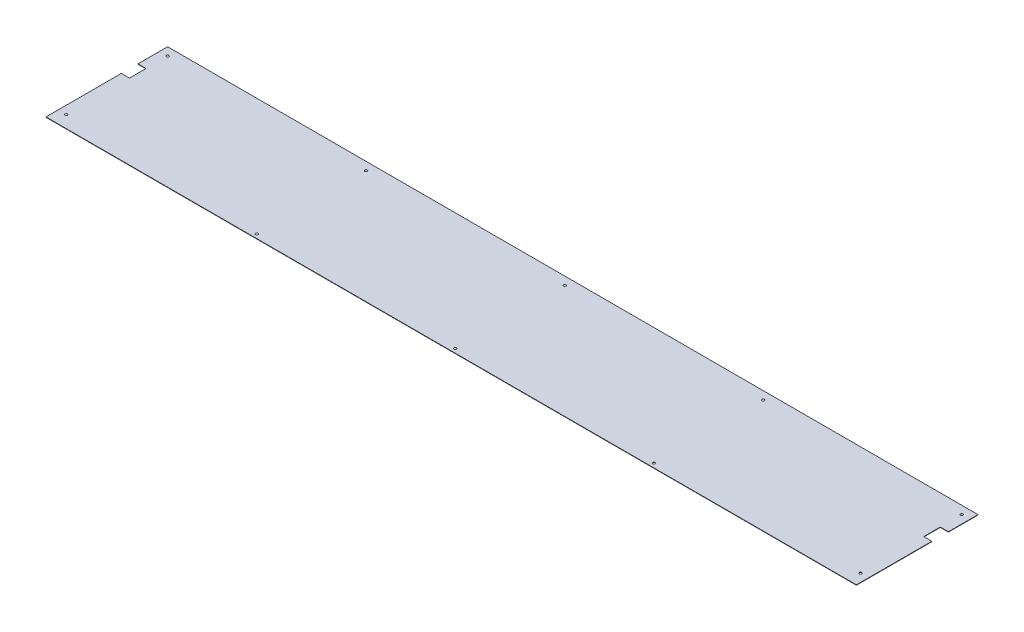
ISO-10303-21;
HEADER;
FILE_DESCRIPTION(('STEP AP214'),'2;1');
FILE_NAME('part.step','',(''),(''),'','','');
FILE_SCHEMA(('AUTOMOTIVE_DESIGN { 1 0 10303 214 1 1 1 1 }'));
ENDSEC;
DATA;
#1=APPLICATION_CONTEXT('core data for automotive mechanical design processes');
#2=APPLICATION_PROTOCOL_DEFINITION('international standard','automotive_design',2000,#1);
#3=PRODUCT_CONTEXT('',#1,'mechanical');
#4=PRODUCT('Part','Part','',(#3));
#5=PRODUCT_RELATED_PRODUCT_CATEGORY('part','',(#4));
#6=PRODUCT_DEFINITION_FORMATION('','',#4);
#7=PRODUCT_DEFINITION_CONTEXT('part definition',#1,'design');
#8=PRODUCT_DEFINITION('design','',#6,#7);
#9=PRODUCT_DEFINITION_SHAPE('','',#8);
#10=(LENGTH_UNIT() NAMED_UNIT(*) SI_UNIT(.MILLI.,.METRE.));
#11=(NAMED_UNIT(*) PLANE_ANGLE_UNIT() SI_UNIT($,.RADIAN.));
#12=(NAMED_UNIT(*) SI_UNIT($,.STERADIAN.) SOLID_ANGLE_UNIT());
#13=UNCERTAINTY_MEASURE_WITH_UNIT(LENGTH_MEASURE(1.E-05),#10,'distance_accuracy_value','');
#14=(GEOMETRIC_REPRESENTATION_CONTEXT(3) GLOBAL_UNCERTAINTY_ASSIGNED_CONTEXT((#13)) GLOBAL_UNIT_ASSIGNED_CONTEXT((#10,
#11,#12)) REPRESENTATION_CONTEXT('',''));
#15=CARTESIAN_POINT('',(0.,0.,0.));
#16=DIRECTION('',(0.,0.,1.));
#17=DIRECTION('',(1.,0.,0.));
#18=AXIS2_PLACEMENT_3D('',#15,#16,#17);
#19=CARTESIAN_POINT('',(-999.999999999999,1.,0.));
#20=DIRECTION('',(-1.,0.,0.));
#21=DIRECTION('',(0.,0.,1.));
#22=AXIS2_PLACEMENT_3D('',#19,#20,#21);
#23=PLANE('',#22);
#24=DIRECTION('',(0.,0.,-1.));
#25=VECTOR('',#24,1.);
#26=CARTESIAN_POINT('',(-999.999999999999,0.,0.));
#27=LINE('',#26,#25);
#28=CARTESIAN_POINT('',(-999.999999999999,0.,-88.4999999999999));
#29=VERTEX_POINT('',#28);
#30=CARTESIAN_POINT('',(-999.999999999999,0.,-161.5));
#31=VERTEX_POINT('',#30);
#32=EDGE_CURVE('E167',#29,#31,#27,.T.);
#33=ORIENTED_EDGE('',*,*,#32,.F.);
#34=DIRECTION('',(0.,-1.,0.));
#35=VECTOR('',#34,1.);
#36=CARTESIAN_POINT('',(-999.999999999999,1.,-88.4999999999999));
#37=LINE('',#36,#35);
#38=CARTESIAN_POINT('',(-999.999999999999,1.,-88.4999999999999));
#39=VERTEX_POINT('',#38);
#40=EDGE_CURVE('E106',#39,#29,#37,.T.);
#41=ORIENTED_EDGE('',*,*,#40,.F.);
#42=DIRECTION('',(0.,0.,-1.));
#43=VECTOR('',#42,1.);
#44=CARTESIAN_POINT('',(-999.999999999999,1.,0.));
#45=LINE('',#44,#43);
#46=CARTESIAN_POINT('',(-999.999999999999,1.,-161.5));
#47=VERTEX_POINT('',#46);
#48=EDGE_CURVE('E387',#39,#47,#45,.T.);
#49=ORIENTED_EDGE('',*,*,#48,.T.);
#50=DIRECTION('',(0.,-1.,0.));
#51=VECTOR('',#50,1.);
#52=CARTESIAN_POINT('',(-999.999999999999,1.,-161.5));
#53=LINE('',#52,#51);
#54=EDGE_CURVE('E59',#47,#31,#53,.T.);
#55=ORIENTED_EDGE('',*,*,#54,.T.);
#56=EDGE_LOOP('',(#33,#41,#49,#55));
#57=FACE_BOUND('',#56,.T.);
#58=ADVANCED_FACE('F41',(#57),#23,.T.);
#59=CARTESIAN_POINT('',(0.,1.,-88.4999999999999));
#60=DIRECTION('',(0.,0.,-1.));
#61=DIRECTION('',(-1.,0.,0.));
#62=AXIS2_PLACEMENT_3D('',#59,#60,#61);
#63=PLANE('',#62);
#64=DIRECTION('',(1.,0.,0.));
#65=VECTOR('',#64,1.);
#66=CARTESIAN_POINT('',(0.,0.,-88.4999999999999));
#67=LINE('',#66,#65);
#68=CARTESIAN_POINT('',(-980.,0.,-88.4999999999999));
#69=VERTEX_POINT('',#68);
#70=EDGE_CURVE('E170',#29,#69,#67,.T.);
#71=ORIENTED_EDGE('',*,*,#70,.T.);
#72=DIRECTION('',(0.,-1.,0.));
#73=VECTOR('',#72,1.);
#74=CARTESIAN_POINT('',(-980.,1.,-88.4999999999999));
#75=LINE('',#74,#73);
#76=CARTESIAN_POINT('',(-980.,1.,-88.4999999999999));
#77=VERTEX_POINT('',#76);
#78=EDGE_CURVE('E237',#77,#69,#75,.T.);
#79=ORIENTED_EDGE('',*,*,#78,.F.);
#80=DIRECTION('',(1.,0.,0.));
#81=VECTOR('',#80,1.);
#82=CARTESIAN_POINT('',(0.,1.,-88.4999999999999));
#83=LINE('',#82,#81);
#84=EDGE_CURVE('E391',#39,#77,#83,.T.);
#85=ORIENTED_EDGE('',*,*,#84,.F.);
#86=ORIENTED_EDGE('',*,*,#40,.T.);
#87=EDGE_LOOP('',(#71,#79,#85,#86));
#88=FACE_BOUND('',#87,.T.);
#89=ADVANCED_FACE('F298',(#88),#63,.F.);
#90=CARTESIAN_POINT('',(-980.,1.,0.));
#91=DIRECTION('',(1.,0.,0.));
#92=DIRECTION('',(0.,0.,-1.));
#93=AXIS2_PLACEMENT_3D('',#90,#91,#92);
#94=PLANE('',#93);
#95=DIRECTION('',(0.,0.,1.));
#96=VECTOR('',#95,1.);
#97=CARTESIAN_POINT('',(-980.,0.,0.));
#98=LINE('',#97,#96);
#99=CARTESIAN_POINT('',(-980.,0.,-47.4999999999999));
#100=VERTEX_POINT('',#99);
#101=EDGE_CURVE('E174',#69,#100,#98,.T.);
#102=ORIENTED_EDGE('',*,*,#101,.T.);
#103=DIRECTION('',(0.,-1.,0.));
#104=VECTOR('',#103,1.);
#105=CARTESIAN_POINT('',(-980.,1.,-47.4999999999999));
#106=LINE('',#105,#104);
#107=CARTESIAN_POINT('',(-980.,1.,-47.4999999999999));
#108=VERTEX_POINT('',#107);
#109=EDGE_CURVE('E234',#108,#100,#106,.T.);
#110=ORIENTED_EDGE('',*,*,#109,.F.);
#111=DIRECTION('',(0.,0.,1.));
#112=VECTOR('',#111,1.);
#113=CARTESIAN_POINT('',(-980.,1.,0.));
#114=LINE('',#113,#112);
#115=EDGE_CURVE('E399',#77,#108,#114,.T.);
#116=ORIENTED_EDGE('',*,*,#115,.F.);
#117=ORIENTED_EDGE('',*,*,#78,.T.);
#118=EDGE_LOOP('',(#102,#110,#116,#117));
#119=FACE_BOUND('',#118,.T.);
#120=ADVANCED_FACE('F303',(#119),#94,.F.);
#121=CARTESIAN_POINT('',(-6.09755301806008E-13,1.,-47.5000000000125));
#122=DIRECTION('',(0.,0.,-1.));
#123=DIRECTION('',(-1.,0.,0.));
#124=AXIS2_PLACEMENT_3D('',#121,#122,#123);
#125=PLANE('',#124);
#126=DIRECTION('',(1.,0.,0.));
#127=VECTOR('',#126,1.);
#128=CARTESIAN_POINT('',(-6.09755301806008E-13,0.,-47.5000000000125));
#129=LINE('',#128,#127);
#130=CARTESIAN_POINT('',(-999.999999999999,0.,-47.4999999999997));
#131=VERTEX_POINT('',#130);
#132=EDGE_CURVE('E178',#131,#100,#129,.T.);
#133=ORIENTED_EDGE('',*,*,#132,.F.);
#134=DIRECTION('',(0.,-1.,0.));
#135=VECTOR('',#134,1.);
#136=CARTESIAN_POINT('',(-999.999999999999,1.,-47.4999999999997));
#137=LINE('',#136,#135);
#138=CARTESIAN_POINT('',(-999.999999999999,1.,-47.4999999999997));
#139=VERTEX_POINT('',#138);
#140=EDGE_CURVE('E231',#139,#131,#137,.T.);
#141=ORIENTED_EDGE('',*,*,#140,.F.);
#142=DIRECTION('',(1.,0.,0.));
#143=VECTOR('',#142,1.);
#144=CARTESIAN_POINT('',(-6.09755301806008E-13,1.,-47.5000000000125));
#145=LINE('',#144,#143);
#146=EDGE_CURVE('E402',#139,#108,#145,.T.);
#147=ORIENTED_EDGE('',*,*,#146,.T.);
#148=ORIENTED_EDGE('',*,*,#109,.T.);
#149=EDGE_LOOP('',(#133,#141,#147,#148));
#150=FACE_BOUND('',#149,.T.);
#151=ADVANCED_FACE('F309',(#150),#125,.T.);
#152=CARTESIAN_POINT('',(-1000.,1.,0.));
#153=DIRECTION('',(1.,0.,0.));
#154=DIRECTION('',(0.,0.,-1.));
#155=AXIS2_PLACEMENT_3D('',#152,#153,#154);
#156=PLANE('',#155);
#157=DIRECTION('',(0.,0.,1.));
#158=VECTOR('',#157,1.);
#159=CARTESIAN_POINT('',(-1000.,0.,0.));
#160=LINE('',#159,#158);
#161=CARTESIAN_POINT('',(-999.999999999999,0.,138.5));
#162=VERTEX_POINT('',#161);
#163=EDGE_CURVE('E182',#131,#162,#160,.T.);
#164=ORIENTED_EDGE('',*,*,#163,.T.);
#165=DIRECTION('',(0.,-1.,0.));
#166=VECTOR('',#165,1.);
#167=CARTESIAN_POINT('',(-999.999999999999,1.,138.5));
#168=LINE('',#167,#166);
#169=CARTESIAN_POINT('',(-999.999999999999,1.,138.5));
#170=VERTEX_POINT('',#169);
#171=EDGE_CURVE('E227',#170,#162,#168,.T.);
#172=ORIENTED_EDGE('',*,*,#171,.F.);
#173=DIRECTION('',(0.,0.,1.));
#174=VECTOR('',#173,1.);
#175=CARTESIAN_POINT('',(-1000.,1.,0.));
#176=LINE('',#175,#174);
#177=EDGE_CURVE('E406',#139,#170,#176,.T.);
#178=ORIENTED_EDGE('',*,*,#177,.F.);
#179=ORIENTED_EDGE('',*,*,#140,.T.);
#180=EDGE_LOOP('',(#164,#172,#178,#179));
#181=FACE_BOUND('',#180,.T.);
#182=ADVANCED_FACE('F313',(#181),#156,.F.);
#183=CARTESIAN_POINT('',(0.,1.,138.5));
#184=DIRECTION('',(0.,0.,-1.));
#185=DIRECTION('',(-1.,0.,0.));
#186=AXIS2_PLACEMENT_3D('',#183,#184,#185);
#187=PLANE('',#186);
#188=DIRECTION('',(1.,0.,0.));
#189=VECTOR('',#188,1.);
#190=CARTESIAN_POINT('',(0.,0.,138.5));
#191=LINE('',#190,#189);
#192=CARTESIAN_POINT('',(1000.,0.,138.5));
#193=VERTEX_POINT('',#192);
#194=EDGE_CURVE('E186',#162,#193,#191,.T.);
#195=ORIENTED_EDGE('',*,*,#194,.T.);
#196=DIRECTION('',(0.,-1.,0.));
#197=VECTOR('',#196,1.);
#198=CARTESIAN_POINT('',(1000.,1.,138.5));
#199=LINE('',#198,#197);
#200=CARTESIAN_POINT('',(1000.,1.,138.5));
#201=VERTEX_POINT('',#200);
#202=EDGE_CURVE('E224',#201,#193,#199,.T.);
#203=ORIENTED_EDGE('',*,*,#202,.F.);
#204=DIRECTION('',(1.,0.,0.));
#205=VECTOR('',#204,1.);
#206=CARTESIAN_POINT('',(0.,1.,138.5));
#207=LINE('',#206,#205);
#208=EDGE_CURVE('E410',#170,#201,#207,.T.);
#209=ORIENTED_EDGE('',*,*,#208,.F.);
#210=ORIENTED_EDGE('',*,*,#171,.T.);
#211=EDGE_LOOP('',(#195,#203,#209,#210));
#212=FACE_BOUND('',#211,.T.);
#213=ADVANCED_FACE('F317',(#212),#187,.F.);
#214=CARTESIAN_POINT('',(1000.,1.,0.));
#215=DIRECTION('',(1.,0.,0.));
#216=DIRECTION('',(0.,0.,-1.));
#217=AXIS2_PLACEMENT_3D('',#214,#215,#216);
#218=PLANE('',#217);
#219=DIRECTION('',(0.,0.,1.));
#220=VECTOR('',#219,1.);
#221=CARTESIAN_POINT('',(1000.,0.,0.));
#222=LINE('',#221,#220);
#223=CARTESIAN_POINT('',(1000.,0.,-47.4999999999997));
#224=VERTEX_POINT('',#223);
#225=EDGE_CURVE('E190',#224,#193,#222,.T.);
#226=ORIENTED_EDGE('',*,*,#225,.F.);
#227=DIRECTION('',(0.,-1.,0.));
#228=VECTOR('',#227,1.);
#229=CARTESIAN_POINT('',(1000.,1.,-47.4999999999997));
#230=LINE('',#229,#228);
#231=CARTESIAN_POINT('',(1000.,1.,-47.4999999999997));
#232=VERTEX_POINT('',#231);
#233=EDGE_CURVE('E221',#232,#224,#230,.T.);
#234=ORIENTED_EDGE('',*,*,#233,.F.);
#235=DIRECTION('',(0.,0.,1.));
#236=VECTOR('',#235,1.);
#237=CARTESIAN_POINT('',(1000.,1.,0.));
#238=LINE('',#237,#236);
#239=EDGE_CURVE('E413',#232,#201,#238,.T.);
#240=ORIENTED_EDGE('',*,*,#239,.T.);
#241=ORIENTED_EDGE('',*,*,#202,.T.);
#242=EDGE_LOOP('',(#226,#234,#240,#241));
#243=FACE_BOUND('',#242,.T.);
#244=ADVANCED_FACE('F321',(#243),#218,.T.);
#245=CARTESIAN_POINT('',(2.02702438168071E-12,1.,-47.5000000000424));
#246=DIRECTION('',(0.,0.,-1.));
#247=DIRECTION('',(-1.,0.,0.));
#248=AXIS2_PLACEMENT_3D('',#245,#246,#247);
#249=PLANE('',#248);
#250=DIRECTION('',(1.,0.,0.));
#251=VECTOR('',#250,1.);
#252=CARTESIAN_POINT('',(2.02702438168071E-12,0.,-47.5000000000424));
#253=LINE('',#252,#251);
#254=CARTESIAN_POINT('',(980.,0.,-47.5000000000005));
#255=VERTEX_POINT('',#254);
#256=EDGE_CURVE('E194',#255,#224,#253,.T.);
#257=ORIENTED_EDGE('',*,*,#256,.F.);
#258=DIRECTION('',(0.,-1.,0.));
#259=VECTOR('',#258,1.);
#260=CARTESIAN_POINT('',(980.,1.,-47.5000000000005));
#261=LINE('',#260,#259);
#262=CARTESIAN_POINT('',(980.,1.,-47.5000000000005));
#263=VERTEX_POINT('',#262);
#264=EDGE_CURVE('E218',#263,#255,#261,.T.);
#265=ORIENTED_EDGE('',*,*,#264,.F.);
#266=DIRECTION('',(1.,0.,0.));
#267=VECTOR('',#266,1.);
#268=CARTESIAN_POINT('',(2.02702438168071E-12,1.,-47.5000000000424));
#269=LINE('',#268,#267);
#270=EDGE_CURVE('E417',#263,#232,#269,.T.);
#271=ORIENTED_EDGE('',*,*,#270,.T.);
#272=ORIENTED_EDGE('',*,*,#233,.T.);
#273=EDGE_LOOP('',(#257,#265,#271,#272));
#274=FACE_BOUND('',#273,.T.);
#275=ADVANCED_FACE('F325',(#274),#249,.T.);
#276=CARTESIAN_POINT('',(980.,1.,0.));
#277=DIRECTION('',(1.,0.,0.));
#278=DIRECTION('',(0.,0.,-1.));
#279=AXIS2_PLACEMENT_3D('',#276,#277,#278);
#280=PLANE('',#279);
#281=DIRECTION('',(0.,0.,1.));
#282=VECTOR('',#281,1.);
#283=CARTESIAN_POINT('',(980.,0.,0.));
#284=LINE('',#283,#282);
#285=CARTESIAN_POINT('',(980.,0.,-88.5000000000006));
#286=VERTEX_POINT('',#285);
#287=EDGE_CURVE('E198',#286,#255,#284,.T.);
#288=ORIENTED_EDGE('',*,*,#287,.F.);
#289=DIRECTION('',(0.,-1.,0.));
#290=VECTOR('',#289,1.);
#291=CARTESIAN_POINT('',(980.,1.,-88.5000000000006));
#292=LINE('',#291,#290);
#293=CARTESIAN_POINT('',(980.,1.,-88.5000000000006));
#294=VERTEX_POINT('',#293);
#295=EDGE_CURVE('E157',#294,#286,#292,.T.);
#296=ORIENTED_EDGE('',*,*,#295,.F.);
#297=DIRECTION('',(0.,0.,1.));
#298=VECTOR('',#297,1.);
#299=CARTESIAN_POINT('',(980.,1.,0.));
#300=LINE('',#299,#298);
#301=EDGE_CURVE('E145',#294,#263,#300,.T.);
#302=ORIENTED_EDGE('',*,*,#301,.T.);
#303=ORIENTED_EDGE('',*,*,#264,.T.);
#304=EDGE_LOOP('',(#288,#296,#302,#303));
#305=FACE_BOUND('',#304,.T.);
#306=ADVANCED_FACE('F329',(#305),#280,.T.);
#307=CARTESIAN_POINT('',(2.7020052861824E-12,1.,-88.5000000000305));
#308=DIRECTION('',(0.,0.,-1.));
#309=DIRECTION('',(-1.,0.,0.));
#310=AXIS2_PLACEMENT_3D('',#307,#308,#309);
#311=PLANE('',#310);
#312=DIRECTION('',(1.,0.,0.));
#313=VECTOR('',#312,1.);
#314=CARTESIAN_POINT('',(2.7020052861824E-12,0.,-88.5000000000305));
#315=LINE('',#314,#313);
#316=CARTESIAN_POINT('',(1000.,0.,-88.4999999999999));
#317=VERTEX_POINT('',#316);
#318=EDGE_CURVE('E153',#286,#317,#315,.T.);
#319=ORIENTED_EDGE('',*,*,#318,.T.);
#320=DIRECTION('',(0.,-1.,0.));
#321=VECTOR('',#320,1.);
#322=CARTESIAN_POINT('',(1000.,1.,-88.4999999999999));
#323=LINE('',#322,#321);
#324=CARTESIAN_POINT('',(1000.,1.,-88.4999999999999));
#325=VERTEX_POINT('',#324);
#326=EDGE_CURVE('E150',#325,#317,#323,.T.);
#327=ORIENTED_EDGE('',*,*,#326,.F.);
#328=DIRECTION('',(1.,0.,0.));
#329=VECTOR('',#328,1.);
#330=CARTESIAN_POINT('',(2.7020052861824E-12,1.,-88.5000000000305));
#331=LINE('',#330,#329);
#332=EDGE_CURVE('E136',#294,#325,#331,.T.);
#333=ORIENTED_EDGE('',*,*,#332,.F.);
#334=ORIENTED_EDGE('',*,*,#295,.T.);
#335=EDGE_LOOP('',(#319,#327,#333,#334));
#336=FACE_BOUND('',#335,.T.);
#337=ADVANCED_FACE('F151',(#336),#311,.F.);
#338=CARTESIAN_POINT('',(1000.,1.,0.));
#339=DIRECTION('',(1.,0.,0.));
#340=DIRECTION('',(0.,0.,-1.));
#341=AXIS2_PLACEMENT_3D('',#338,#339,#340);
#342=PLANE('',#341);
#343=DIRECTION('',(0.,0.,1.));
#344=VECTOR('',#343,1.);
#345=CARTESIAN_POINT('',(1000.,0.,0.));
#346=LINE('',#345,#344);
#347=CARTESIAN_POINT('',(1000.,0.,-161.5));
#348=VERTEX_POINT('',#347);
#349=EDGE_CURVE('E204',#348,#317,#346,.T.);
#350=ORIENTED_EDGE('',*,*,#349,.F.);
#351=DIRECTION('',(0.,-1.,0.));
#352=VECTOR('',#351,1.);
#353=CARTESIAN_POINT('',(1000.,1.,-161.5));
#354=LINE('',#353,#352);
#355=CARTESIAN_POINT('',(1000.,1.,-161.5));
#356=VERTEX_POINT('',#355);
#357=EDGE_CURVE('E97',#356,#348,#354,.T.);
#358=ORIENTED_EDGE('',*,*,#357,.F.);
#359=DIRECTION('',(0.,0.,1.));
#360=VECTOR('',#359,1.);
#361=CARTESIAN_POINT('',(1000.,1.,0.));
#362=LINE('',#361,#360);
#363=EDGE_CURVE('E142',#356,#325,#362,.T.);
#364=ORIENTED_EDGE('',*,*,#363,.T.);
#365=ORIENTED_EDGE('',*,*,#326,.T.);
#366=EDGE_LOOP('',(#350,#358,#364,#365));
#367=FACE_BOUND('',#366,.T.);
#368=ADVANCED_FACE('F159',(#367),#342,.T.);
#369=CARTESIAN_POINT('',(0.,1.,-161.5));
#370=DIRECTION('',(0.,0.,-1.));
#371=DIRECTION('',(-1.,0.,0.));
#372=AXIS2_PLACEMENT_3D('',#369,#370,#371);
#373=PLANE('',#372);
#374=DIRECTION('',(1.,0.,0.));
#375=VECTOR('',#374,1.);
#376=CARTESIAN_POINT('',(0.,0.,-161.5));
#377=LINE('',#376,#375);
#378=EDGE_CURVE('E207',#31,#348,#377,.T.);
#379=ORIENTED_EDGE('',*,*,#378,.F.);
#380=ORIENTED_EDGE('',*,*,#54,.F.);
#381=DIRECTION('',(1.,0.,0.));
#382=VECTOR('',#381,1.);
#383=CARTESIAN_POINT('',(0.,1.,-161.5));
#384=LINE('',#383,#382);
#385=EDGE_CURVE('E161',#47,#356,#384,.T.);
#386=ORIENTED_EDGE('',*,*,#385,.T.);
#387=ORIENTED_EDGE('',*,*,#357,.T.);
#388=EDGE_LOOP('',(#379,#380,#386,#387));
#389=FACE_BOUND('',#388,.T.);
#390=ADVANCED_FACE('F338',(#389),#373,.T.);
#391=CARTESIAN_POINT('',(0.,1.,0.));
#392=DIRECTION('',(0.,1.,0.));
#393=DIRECTION('',(0.,0.,1.));
#394=AXIS2_PLACEMENT_3D('',#391,#392,#393);
#395=PLANE('',#394);
#396=CARTESIAN_POINT('',(-979.999999999999,1.,108.5));
#397=DIRECTION('',(0.,1.,0.));
#398=DIRECTION('',(0.,0.,1.));
#399=AXIS2_PLACEMENT_3D('',#396,#397,#398);
#400=CIRCLE('',#399,3.00000000000005);
#401=CARTESIAN_POINT('',(-979.999999999999,1.,111.5));
#402=VERTEX_POINT('',#401);
#403=EDGE_CURVE('E211',#402,#402,#400,.T.);
#404=ORIENTED_EDGE('',*,*,#403,.F.);
#405=EDGE_LOOP('',(#404));
#406=FACE_BOUND('',#405,.T.);
#407=CARTESIAN_POINT('',(-489.999999999999,1.,128.5));
#408=DIRECTION('',(0.,1.,0.));
#409=DIRECTION('',(0.,0.,1.));
#410=AXIS2_PLACEMENT_3D('',#407,#408,#409);
#411=CIRCLE('',#410,2.99999999999999);
#412=CARTESIAN_POINT('',(-489.999999999999,1.,131.5));
#413=VERTEX_POINT('',#412);
#414=EDGE_CURVE('E354',#413,#413,#411,.T.);
#415=ORIENTED_EDGE('',*,*,#414,.F.);
#416=EDGE_LOOP('',(#415));
#417=FACE_BOUND('',#416,.T.);
#418=CARTESIAN_POINT('',(5.48833650015357E-13,1.,128.5));
#419=DIRECTION('',(0.,1.,0.));
#420=DIRECTION('',(0.,0.,1.));
#421=AXIS2_PLACEMENT_3D('',#418,#419,#420);
#422=CIRCLE('',#421,3.);
#423=CARTESIAN_POINT('',(5.48833650015357E-13,1.,131.5));
#424=VERTEX_POINT('',#423);
#425=EDGE_CURVE('E358',#424,#424,#422,.T.);
#426=ORIENTED_EDGE('',*,*,#425,.F.);
#427=EDGE_LOOP('',(#426));
#428=FACE_BOUND('',#427,.T.);
#429=CARTESIAN_POINT('',(980.000000000001,1.,108.5));
#430=DIRECTION('',(0.,1.,0.));
#431=DIRECTION('',(0.,0.,1.));
#432=AXIS2_PLACEMENT_3D('',#429,#430,#431);
#433=CIRCLE('',#432,3.00000000000005);
#434=CARTESIAN_POINT('',(980.000000000001,1.,111.5));
#435=VERTEX_POINT('',#434);
#436=EDGE_CURVE('E362',#435,#435,#433,.T.);
#437=ORIENTED_EDGE('',*,*,#436,.F.);
#438=EDGE_LOOP('',(#437));
#439=FACE_BOUND('',#438,.T.);
#440=CARTESIAN_POINT('',(490.000000000001,1.,128.5));
#441=DIRECTION('',(0.,1.,0.));
#442=DIRECTION('',(0.,0.,1.));
#443=AXIS2_PLACEMENT_3D('',#440,#441,#442);
#444=CIRCLE('',#443,2.99999999999999);
#445=CARTESIAN_POINT('',(490.000000000001,1.,131.5));
#446=VERTEX_POINT('',#445);
#447=EDGE_CURVE('E365',#446,#446,#444,.T.);
#448=ORIENTED_EDGE('',*,*,#447,.F.);
#449=EDGE_LOOP('',(#448));
#450=FACE_BOUND('',#449,.T.);
#451=CARTESIAN_POINT('',(-489.999999999999,1.,-141.5));
#452=DIRECTION('',(0.,1.,0.));
#453=DIRECTION('',(0.,0.,1.));
#454=AXIS2_PLACEMENT_3D('',#451,#452,#453);
#455=CIRCLE('',#454,2.99999999999999);
#456=CARTESIAN_POINT('',(-489.999999999999,1.,-138.5));
#457=VERTEX_POINT('',#456);
#458=EDGE_CURVE('E369',#457,#457,#455,.T.);
#459=ORIENTED_EDGE('',*,*,#458,.F.);
#460=EDGE_LOOP('',(#459));
#461=FACE_BOUND('',#460,.T.);
#462=CARTESIAN_POINT('',(490.000000000001,1.,-141.5));
#463=DIRECTION('',(0.,1.,0.));
#464=DIRECTION('',(0.,0.,1.));
#465=AXIS2_PLACEMENT_3D('',#462,#463,#464);
#466=CIRCLE('',#465,2.99999999999999);
#467=CARTESIAN_POINT('',(490.000000000001,1.,-138.5));
#468=VERTEX_POINT('',#467);
#469=EDGE_CURVE('E373',#468,#468,#466,.T.);
#470=ORIENTED_EDGE('',*,*,#469,.F.);
#471=EDGE_LOOP('',(#470));
#472=FACE_BOUND('',#471,.T.);
#473=CARTESIAN_POINT('',(5.55111512312578E-13,1.,-141.5));
#474=DIRECTION('',(0.,1.,0.));
#475=DIRECTION('',(0.,0.,1.));
#476=AXIS2_PLACEMENT_3D('',#473,#474,#475);
#477=CIRCLE('',#476,3.);
#478=CARTESIAN_POINT('',(5.55111512312578E-13,1.,-138.5));
#479=VERTEX_POINT('',#478);
#480=EDGE_CURVE('E377',#479,#479,#477,.T.);
#481=ORIENTED_EDGE('',*,*,#480,.F.);
#482=EDGE_LOOP('',(#481));
#483=FACE_BOUND('',#482,.T.);
#484=CARTESIAN_POINT('',(980.000000000001,1.,-141.5));
#485=DIRECTION('',(0.,1.,0.));
#486=DIRECTION('',(0.,0.,1.));
#487=AXIS2_PLACEMENT_3D('',#484,#485,#486);
#488=CIRCLE('',#487,3.00000000000005);
#489=CARTESIAN_POINT('',(980.000000000001,1.,-138.5));
#490=VERTEX_POINT('',#489);
#491=EDGE_CURVE('E381',#490,#490,#488,.T.);
#492=ORIENTED_EDGE('',*,*,#491,.F.);
#493=EDGE_LOOP('',(#492));
#494=FACE_BOUND('',#493,.T.);
#495=CARTESIAN_POINT('',(-979.999999999999,1.,-141.5));
#496=DIRECTION('',(0.,1.,0.));
#497=DIRECTION('',(0.,0.,1.));
#498=AXIS2_PLACEMENT_3D('',#495,#496,#497);
#499=CIRCLE('',#498,3.00000000000005);
#500=CARTESIAN_POINT('',(-979.999999999999,1.,-138.5));
#501=VERTEX_POINT('',#500);
#502=EDGE_CURVE('E384',#501,#501,#499,.T.);
#503=ORIENTED_EDGE('',*,*,#502,.F.);
#504=EDGE_LOOP('',(#503));
#505=FACE_BOUND('',#504,.T.);
#506=ORIENTED_EDGE('',*,*,#48,.F.);
#507=ORIENTED_EDGE('',*,*,#84,.T.);
#508=ORIENTED_EDGE('',*,*,#115,.T.);
#509=ORIENTED_EDGE('',*,*,#146,.F.);
#510=ORIENTED_EDGE('',*,*,#177,.T.);
#511=ORIENTED_EDGE('',*,*,#208,.T.);
#512=ORIENTED_EDGE('',*,*,#239,.F.);
#513=ORIENTED_EDGE('',*,*,#270,.F.);
#514=ORIENTED_EDGE('',*,*,#301,.F.);
#515=ORIENTED_EDGE('',*,*,#332,.T.);
#516=ORIENTED_EDGE('',*,*,#363,.F.);
#517=ORIENTED_EDGE('',*,*,#385,.F.);
#518=EDGE_LOOP('',(#506,#507,#508,#509,#510,#511,#512,#513,#514,#515,#516,#517));
#519=FACE_BOUND('',#518,.T.);
#520=ADVANCED_FACE('F139',(#406,#417,#428,#439,#450,#461,#472,#483,#494,#505,#519),#395,.T.);
#521=CARTESIAN_POINT('',(0.,0.,0.));
#522=DIRECTION('',(0.,1.,0.));
#523=DIRECTION('',(0.,0.,1.));
#524=AXIS2_PLACEMENT_3D('',#521,#522,#523);
#525=PLANE('',#524);
#526=CARTESIAN_POINT('',(980.000000000001,0.,108.5));
#527=DIRECTION('',(0.,1.,0.));
#528=DIRECTION('',(0.,0.,1.));
#529=AXIS2_PLACEMENT_3D('',#526,#527,#528);
#530=CIRCLE('',#529,4.00000000000023);
#531=CARTESIAN_POINT('',(980.000000000001,0.,112.5));
#532=VERTEX_POINT('',#531);
#533=EDGE_CURVE('E11',#532,#532,#530,.T.);
#534=ORIENTED_EDGE('',*,*,#533,.T.);
#535=EDGE_LOOP('',(#534));
#536=FACE_BOUND('',#535,.T.);
#537=CARTESIAN_POINT('',(490.000000000001,0.,128.5));
#538=DIRECTION('',(0.,1.,0.));
#539=DIRECTION('',(0.,0.,1.));
#540=AXIS2_PLACEMENT_3D('',#537,#538,#539);
#541=CIRCLE('',#540,3.99999999999998);
#542=CARTESIAN_POINT('',(490.000000000001,0.,132.5));
#543=VERTEX_POINT('',#542);
#544=EDGE_CURVE('E51',#543,#543,#541,.T.);
#545=ORIENTED_EDGE('',*,*,#544,.T.);
#546=EDGE_LOOP('',(#545));
#547=FACE_BOUND('',#546,.T.);
#548=CARTESIAN_POINT('',(5.48833650015357E-13,0.,128.5));
#549=DIRECTION('',(0.,1.,0.));
#550=DIRECTION('',(0.,0.,1.));
#551=AXIS2_PLACEMENT_3D('',#548,#549,#550);
#552=CIRCLE('',#551,3.99999999999956);
#553=CARTESIAN_POINT('',(5.48833650015357E-13,0.,132.5));
#554=VERTEX_POINT('',#553);
#555=EDGE_CURVE('E271',#554,#554,#552,.T.);
#556=ORIENTED_EDGE('',*,*,#555,.T.);
#557=EDGE_LOOP('',(#556));
#558=FACE_BOUND('',#557,.T.);
#559=CARTESIAN_POINT('',(-489.999999999999,0.,128.5));
#560=DIRECTION('',(0.,1.,0.));
#561=DIRECTION('',(0.,0.,1.));
#562=AXIS2_PLACEMENT_3D('',#559,#560,#561);
#563=CIRCLE('',#562,3.99999999999998);
#564=CARTESIAN_POINT('',(-489.999999999999,0.,132.5));
#565=VERTEX_POINT('',#564);
#566=EDGE_CURVE('E267',#565,#565,#563,.T.);
#567=ORIENTED_EDGE('',*,*,#566,.T.);
#568=EDGE_LOOP('',(#567));
#569=FACE_BOUND('',#568,.T.);
#570=CARTESIAN_POINT('',(-979.999999999999,0.,108.5));
#571=DIRECTION('',(0.,1.,0.));
#572=DIRECTION('',(0.,0.,1.));
#573=AXIS2_PLACEMENT_3D('',#570,#571,#572);
#574=CIRCLE('',#573,4.00000000000023);
#575=CARTESIAN_POINT('',(-979.999999999999,0.,112.5));
#576=VERTEX_POINT('',#575);
#577=EDGE_CURVE('E263',#576,#576,#574,.T.);
#578=ORIENTED_EDGE('',*,*,#577,.T.);
#579=EDGE_LOOP('',(#578));
#580=FACE_BOUND('',#579,.T.);
#581=CARTESIAN_POINT('',(-979.999999999999,0.,-141.5));
#582=DIRECTION('',(0.,1.,0.));
#583=DIRECTION('',(0.,0.,1.));
#584=AXIS2_PLACEMENT_3D('',#581,#582,#583);
#585=CIRCLE('',#584,4.00000000000023);
#586=CARTESIAN_POINT('',(-979.999999999999,0.,-137.5));
#587=VERTEX_POINT('',#586);
#588=EDGE_CURVE('E259',#587,#587,#585,.T.);
#589=ORIENTED_EDGE('',*,*,#588,.T.);
#590=EDGE_LOOP('',(#589));
#591=FACE_BOUND('',#590,.T.);
#592=CARTESIAN_POINT('',(-489.999999999999,0.,-141.5));
#593=DIRECTION('',(0.,1.,0.));
#594=DIRECTION('',(0.,0.,1.));
#595=AXIS2_PLACEMENT_3D('',#592,#593,#594);
#596=CIRCLE('',#595,4.00000000000067);
#597=CARTESIAN_POINT('',(-489.999999999999,0.,-137.499999999999));
#598=VERTEX_POINT('',#597);
#599=EDGE_CURVE('E255',#598,#598,#596,.T.);
#600=ORIENTED_EDGE('',*,*,#599,.T.);
#601=EDGE_LOOP('',(#600));
#602=FACE_BOUND('',#601,.T.);
#603=CARTESIAN_POINT('',(5.55111512312578E-13,0.,-141.5));
#604=DIRECTION('',(0.,1.,0.));
#605=DIRECTION('',(0.,0.,1.));
#606=AXIS2_PLACEMENT_3D('',#603,#604,#605);
#607=CIRCLE('',#606,3.99999999999956);
#608=CARTESIAN_POINT('',(5.55111512312578E-13,0.,-137.5));
#609=VERTEX_POINT('',#608);
#610=EDGE_CURVE('E251',#609,#609,#607,.T.);
#611=ORIENTED_EDGE('',*,*,#610,.T.);
#612=EDGE_LOOP('',(#611));
#613=FACE_BOUND('',#612,.T.);
#614=CARTESIAN_POINT('',(490.000000000001,0.,-141.5));
#615=DIRECTION('',(0.,1.,0.));
#616=DIRECTION('',(0.,0.,1.));
#617=AXIS2_PLACEMENT_3D('',#614,#615,#616);
#618=CIRCLE('',#617,4.00000000000067);
#619=CARTESIAN_POINT('',(490.000000000001,0.,-137.499999999999));
#620=VERTEX_POINT('',#619);
#621=EDGE_CURVE('E247',#620,#620,#618,.T.);
#622=ORIENTED_EDGE('',*,*,#621,.T.);
#623=EDGE_LOOP('',(#622));
#624=FACE_BOUND('',#623,.T.);
#625=CARTESIAN_POINT('',(980.000000000001,0.,-141.5));
#626=DIRECTION('',(0.,1.,0.));
#627=DIRECTION('',(0.,0.,1.));
#628=AXIS2_PLACEMENT_3D('',#625,#626,#627);
#629=CIRCLE('',#628,4.00000000000023);
#630=CARTESIAN_POINT('',(980.000000000001,0.,-137.5));
#631=VERTEX_POINT('',#630);
#632=EDGE_CURVE('E243',#631,#631,#629,.T.);
#633=ORIENTED_EDGE('',*,*,#632,.T.);
#634=EDGE_LOOP('',(#633));
#635=FACE_BOUND('',#634,.T.);
#636=ORIENTED_EDGE('',*,*,#32,.T.);
#637=ORIENTED_EDGE('',*,*,#378,.T.);
#638=ORIENTED_EDGE('',*,*,#349,.T.);
#639=ORIENTED_EDGE('',*,*,#318,.F.);
#640=ORIENTED_EDGE('',*,*,#287,.T.);
#641=ORIENTED_EDGE('',*,*,#256,.T.);
#642=ORIENTED_EDGE('',*,*,#225,.T.);
#643=ORIENTED_EDGE('',*,*,#194,.F.);
#644=ORIENTED_EDGE('',*,*,#163,.F.);
#645=ORIENTED_EDGE('',*,*,#132,.T.);
#646=ORIENTED_EDGE('',*,*,#101,.F.);
#647=ORIENTED_EDGE('',*,*,#70,.F.);
#648=EDGE_LOOP('',(#636,#637,#638,#639,#640,#641,#642,#643,#644,#645,#646,#647));
#649=FACE_BOUND('',#648,.T.);
#650=ADVANCED_FACE('F278',(#536,#547,#558,#569,#580,#591,#602,#613,#624,#635,#649),#525,.F.);
#651=CARTESIAN_POINT('',(980.000000000001,0.,108.5));
#652=DIRECTION('',(0.,-1.,0.));
#653=DIRECTION('',(0.,0.,-1.));
#654=AXIS2_PLACEMENT_3D('',#651,#652,#653);
#655=CONICAL_SURFACE('',#654,4.00000000000023,0.785398163397554);
#656=ORIENTED_EDGE('',*,*,#436,.T.);
#657=EDGE_LOOP('',(#656));
#658=FACE_BOUND('',#657,.T.);
#659=ORIENTED_EDGE('',*,*,#533,.F.);
#660=EDGE_LOOP('',(#659));
#661=FACE_BOUND('',#660,.T.);
#662=ADVANCED_FACE('F284',(#658,#661),#655,.F.);
#663=CARTESIAN_POINT('',(490.000000000001,0.,128.5));
#664=DIRECTION('',(0.,-1.,0.));
#665=DIRECTION('',(0.,0.,-1.));
#666=AXIS2_PLACEMENT_3D('',#663,#664,#665);
#667=CONICAL_SURFACE('',#666,3.99999999999999,0.785398163397547);
#668=ORIENTED_EDGE('',*,*,#447,.T.);
#669=EDGE_LOOP('',(#668));
#670=FACE_BOUND('',#669,.T.);
#671=ORIENTED_EDGE('',*,*,#544,.F.);
#672=EDGE_LOOP('',(#671));
#673=FACE_BOUND('',#672,.T.);
#674=ADVANCED_FACE('F281',(#670,#673),#667,.F.);
#675=CARTESIAN_POINT('',(5.48833650015357E-13,0.,128.5));
#676=DIRECTION('',(0.,-1.,0.));
#677=DIRECTION('',(0.,0.,-1.));
#678=AXIS2_PLACEMENT_3D('',#675,#676,#677);
#679=CONICAL_SURFACE('',#678,3.99999999999956,0.785398163397554);
#680=ORIENTED_EDGE('',*,*,#425,.T.);
#681=EDGE_LOOP('',(#680));
#682=FACE_BOUND('',#681,.T.);
#683=ORIENTED_EDGE('',*,*,#555,.F.);
#684=EDGE_LOOP('',(#683));
#685=FACE_BOUND('',#684,.T.);
#686=ADVANCED_FACE('F283',(#682,#685),#679,.F.);
#687=CARTESIAN_POINT('',(-489.999999999999,0.,128.5));
#688=DIRECTION('',(0.,-1.,0.));
#689=DIRECTION('',(0.,0.,-1.));
#690=AXIS2_PLACEMENT_3D('',#687,#688,#689);
#691=CONICAL_SURFACE('',#690,3.99999999999999,0.785398163397547);
#692=ORIENTED_EDGE('',*,*,#414,.T.);
#693=EDGE_LOOP('',(#692));
#694=FACE_BOUND('',#693,.T.);
#695=ORIENTED_EDGE('',*,*,#566,.F.);
#696=EDGE_LOOP('',(#695));
#697=FACE_BOUND('',#696,.T.);
#698=ADVANCED_FACE('F291',(#694,#697),#691,.F.);
#699=CARTESIAN_POINT('',(-979.999999999999,0.,108.5));
#700=DIRECTION('',(0.,-1.,0.));
#701=DIRECTION('',(0.,0.,-1.));
#702=AXIS2_PLACEMENT_3D('',#699,#700,#701);
#703=CONICAL_SURFACE('',#702,4.00000000000023,0.785398163397554);
#704=ORIENTED_EDGE('',*,*,#403,.T.);
#705=EDGE_LOOP('',(#704));
#706=FACE_BOUND('',#705,.T.);
#707=ORIENTED_EDGE('',*,*,#577,.F.);
#708=EDGE_LOOP('',(#707));
#709=FACE_BOUND('',#708,.T.);
#710=ADVANCED_FACE('F451',(#706,#709),#703,.F.);
#711=CARTESIAN_POINT('',(-979.999999999999,0.,-141.5));
#712=DIRECTION('',(0.,-1.,0.));
#713=DIRECTION('',(0.,0.,-1.));
#714=AXIS2_PLACEMENT_3D('',#711,#712,#713);
#715=CONICAL_SURFACE('',#714,4.00000000000023,0.785398163397554);
#716=ORIENTED_EDGE('',*,*,#502,.T.);
#717=EDGE_LOOP('',(#716));
#718=FACE_BOUND('',#717,.T.);
#719=ORIENTED_EDGE('',*,*,#588,.F.);
#720=EDGE_LOOP('',(#719));
#721=FACE_BOUND('',#720,.T.);
#722=ADVANCED_FACE('F454',(#718,#721),#715,.F.);
#723=CARTESIAN_POINT('',(-489.999999999999,0.,-141.5));
#724=DIRECTION('',(0.,-1.,0.));
#725=DIRECTION('',(0.,0.,-1.));
#726=AXIS2_PLACEMENT_3D('',#723,#724,#725);
#727=CONICAL_SURFACE('',#726,4.00000000000067,0.785398163397554);
#728=ORIENTED_EDGE('',*,*,#458,.T.);
#729=EDGE_LOOP('',(#728));
#730=FACE_BOUND('',#729,.T.);
#731=ORIENTED_EDGE('',*,*,#599,.F.);
#732=EDGE_LOOP('',(#731));
#733=FACE_BOUND('',#732,.T.);
#734=ADVANCED_FACE('F480',(#730,#733),#727,.F.);
#735=CARTESIAN_POINT('',(5.55111512312578E-13,0.,-141.5));
#736=DIRECTION('',(0.,-1.,0.));
#737=DIRECTION('',(0.,0.,-1.));
#738=AXIS2_PLACEMENT_3D('',#735,#736,#737);
#739=CONICAL_SURFACE('',#738,3.99999999999956,0.785398163397554);
#740=ORIENTED_EDGE('',*,*,#480,.T.);
#741=EDGE_LOOP('',(#740));
#742=FACE_BOUND('',#741,.T.);
#743=ORIENTED_EDGE('',*,*,#610,.F.);
#744=EDGE_LOOP('',(#743));
#745=FACE_BOUND('',#744,.T.);
#746=ADVANCED_FACE('F475',(#742,#745),#739,.F.);
#747=CARTESIAN_POINT('',(490.000000000001,0.,-141.5));
#748=DIRECTION('',(0.,-1.,0.));
#749=DIRECTION('',(0.,0.,-1.));
#750=AXIS2_PLACEMENT_3D('',#747,#748,#749);
#751=CONICAL_SURFACE('',#750,4.00000000000067,0.785398163397554);
#752=ORIENTED_EDGE('',*,*,#469,.T.);
#753=EDGE_LOOP('',(#752));
#754=FACE_BOUND('',#753,.T.);
#755=ORIENTED_EDGE('',*,*,#621,.F.);
#756=EDGE_LOOP('',(#755));
#757=FACE_BOUND('',#756,.T.);
#758=ADVANCED_FACE('F470',(#754,#757),#751,.F.);
#759=CARTESIAN_POINT('',(980.000000000001,0.,-141.5));
#760=DIRECTION('',(0.,-1.,0.));
#761=DIRECTION('',(0.,0.,-1.));
#762=AXIS2_PLACEMENT_3D('',#759,#760,#761);
#763=CONICAL_SURFACE('',#762,4.00000000000023,0.785398163397554);
#764=ORIENTED_EDGE('',*,*,#491,.T.);
#765=EDGE_LOOP('',(#764));
#766=FACE_BOUND('',#765,.T.);
#767=ORIENTED_EDGE('',*,*,#632,.F.);
#768=EDGE_LOOP('',(#767));
#769=FACE_BOUND('',#768,.T.);
#770=ADVANCED_FACE('F43',(#766,#769),#763,.F.);
#771=CLOSED_SHELL('',(#58,#89,#120,#151,#182,#213,#244,#275,#306,#337,#368,#390,#520,#650,#662,
#674,#686,#698,#710,#722,#734,#746,#758,#770));
#772=MANIFOLD_SOLID_BREP('B2',#771);
#773=ADVANCED_BREP_SHAPE_REPRESENTATION('',(#18,#772),#14);
#774=SHAPE_DEFINITION_REPRESENTATION(#9,#773);
ENDSEC;
END-ISO-10303-21;
